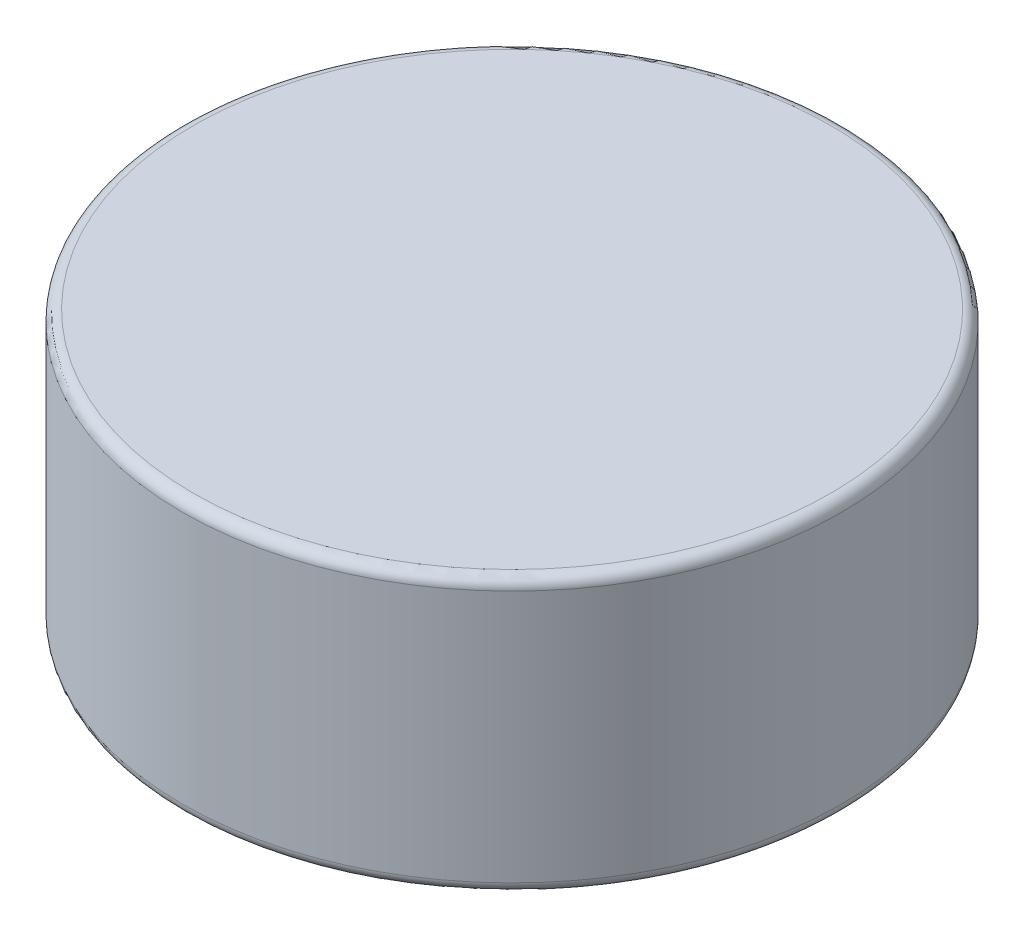
ISO-10303-21;
HEADER;
FILE_DESCRIPTION(('STEP AP214'),'2;1');
FILE_NAME('part.step','',(''),(''),'','','');
FILE_SCHEMA(('AUTOMOTIVE_DESIGN { 1 0 10303 214 1 1 1 1 }'));
ENDSEC;
DATA;
#1=APPLICATION_CONTEXT('core data for automotive mechanical design processes');
#2=APPLICATION_PROTOCOL_DEFINITION('international standard','automotive_design',2000,#1);
#3=PRODUCT_CONTEXT('',#1,'mechanical');
#4=PRODUCT('Part','Part','',(#3));
#5=PRODUCT_RELATED_PRODUCT_CATEGORY('part','',(#4));
#6=PRODUCT_DEFINITION_FORMATION('','',#4);
#7=PRODUCT_DEFINITION_CONTEXT('part definition',#1,'design');
#8=PRODUCT_DEFINITION('design','',#6,#7);
#9=PRODUCT_DEFINITION_SHAPE('','',#8);
#10=(LENGTH_UNIT() NAMED_UNIT(*) SI_UNIT(.MILLI.,.METRE.));
#11=(NAMED_UNIT(*) PLANE_ANGLE_UNIT() SI_UNIT($,.RADIAN.));
#12=(NAMED_UNIT(*) SI_UNIT($,.STERADIAN.) SOLID_ANGLE_UNIT());
#13=UNCERTAINTY_MEASURE_WITH_UNIT(LENGTH_MEASURE(1.E-05),#10,'distance_accuracy_value','');
#14=(GEOMETRIC_REPRESENTATION_CONTEXT(3) GLOBAL_UNCERTAINTY_ASSIGNED_CONTEXT((#13)) GLOBAL_UNIT_ASSIGNED_CONTEXT((#10,
#11,#12)) REPRESENTATION_CONTEXT('',''));
#15=CARTESIAN_POINT('',(0.,0.,0.));
#16=DIRECTION('',(0.,0.,1.));
#17=DIRECTION('',(1.,0.,0.));
#18=AXIS2_PLACEMENT_3D('',#15,#16,#17);
#19=CARTESIAN_POINT('',(0.,1.25,0.));
#20=DIRECTION('',(0.,-1.,0.));
#21=DIRECTION('',(0.,0.,-1.));
#22=AXIS2_PLACEMENT_3D('',#19,#20,#21);
#23=CYLINDRICAL_SURFACE('',#22,3.);
#24=CARTESIAN_POINT('',(0.,-1.15,0.));
#25=DIRECTION('',(0.,1.,0.));
#26=DIRECTION('',(0.,0.,1.));
#27=AXIS2_PLACEMENT_3D('',#24,#25,#26);
#28=CIRCLE('',#27,3.);
#29=CARTESIAN_POINT('',(0.,-1.15,3.));
#30=VERTEX_POINT('',#29);
#31=EDGE_CURVE('E46',#30,#30,#28,.T.);
#32=ORIENTED_EDGE('',*,*,#31,.T.);
#33=EDGE_LOOP('',(#32));
#34=FACE_BOUND('',#33,.T.);
#35=CARTESIAN_POINT('',(0.,1.15,0.));
#36=DIRECTION('',(0.,1.,0.));
#37=DIRECTION('',(0.,0.,1.));
#38=AXIS2_PLACEMENT_3D('',#35,#36,#37);
#39=CIRCLE('',#38,3.);
#40=CARTESIAN_POINT('',(0.,1.15,3.));
#41=VERTEX_POINT('',#40);
#42=EDGE_CURVE('E50',#41,#41,#39,.F.);
#43=ORIENTED_EDGE('',*,*,#42,.T.);
#44=EDGE_LOOP('',(#43));
#45=FACE_BOUND('',#44,.T.);
#46=ADVANCED_FACE('F35',(#34,#45),#23,.T.);
#47=CARTESIAN_POINT('',(0.,1.25,0.));
#48=DIRECTION('',(0.,1.,0.));
#49=DIRECTION('',(0.,0.,1.));
#50=AXIS2_PLACEMENT_3D('',#47,#48,#49);
#51=PLANE('',#50);
#52=CARTESIAN_POINT('',(0.,1.25,0.));
#53=DIRECTION('',(0.,1.,0.));
#54=DIRECTION('',(0.,0.,1.));
#55=AXIS2_PLACEMENT_3D('',#52,#53,#54);
#56=CIRCLE('',#55,2.9);
#57=CARTESIAN_POINT('',(0.,1.25,2.9));
#58=VERTEX_POINT('',#57);
#59=EDGE_CURVE('E10',#58,#58,#56,.T.);
#60=ORIENTED_EDGE('',*,*,#59,.T.);
#61=EDGE_LOOP('',(#60));
#62=FACE_BOUND('',#61,.T.);
#63=ADVANCED_FACE('F66',(#62),#51,.T.);
#64=CARTESIAN_POINT('',(0.,-1.25,0.));
#65=DIRECTION('',(0.,1.,0.));
#66=DIRECTION('',(0.,0.,1.));
#67=AXIS2_PLACEMENT_3D('',#64,#65,#66);
#68=PLANE('',#67);
#69=CARTESIAN_POINT('',(0.,-1.25,0.));
#70=DIRECTION('',(0.,1.,0.));
#71=DIRECTION('',(0.,0.,1.));
#72=AXIS2_PLACEMENT_3D('',#69,#70,#71);
#73=CIRCLE('',#72,2.9);
#74=CARTESIAN_POINT('',(0.,-1.25,2.9));
#75=VERTEX_POINT('',#74);
#76=EDGE_CURVE('E42',#75,#75,#73,.F.);
#77=ORIENTED_EDGE('',*,*,#76,.T.);
#78=EDGE_LOOP('',(#77));
#79=FACE_BOUND('',#78,.T.);
#80=ADVANCED_FACE('F63',(#79),#68,.F.);
#81=CARTESIAN_POINT('',(0.,-1.15,0.));
#82=DIRECTION('',(0.,1.,0.));
#83=DIRECTION('',(0.,0.,1.));
#84=AXIS2_PLACEMENT_3D('',#81,#82,#83);
#85=TOROIDAL_SURFACE('',#84,2.9,0.1);
#86=ORIENTED_EDGE('',*,*,#76,.F.);
#87=EDGE_LOOP('',(#86));
#88=FACE_BOUND('',#87,.T.);
#89=ORIENTED_EDGE('',*,*,#31,.F.);
#90=EDGE_LOOP('',(#89));
#91=FACE_BOUND('',#90,.T.);
#92=ADVANCED_FACE('F59',(#88,#91),#85,.T.);
#93=CARTESIAN_POINT('',(0.,1.15,0.));
#94=DIRECTION('',(0.,1.,0.));
#95=DIRECTION('',(0.,0.,1.));
#96=AXIS2_PLACEMENT_3D('',#93,#94,#95);
#97=TOROIDAL_SURFACE('',#96,2.9,0.1);
#98=ORIENTED_EDGE('',*,*,#42,.F.);
#99=EDGE_LOOP('',(#98));
#100=FACE_BOUND('',#99,.T.);
#101=ORIENTED_EDGE('',*,*,#59,.F.);
#102=EDGE_LOOP('',(#101));
#103=FACE_BOUND('',#102,.T.);
#104=ADVANCED_FACE('F37',(#100,#103),#97,.T.);
#105=CLOSED_SHELL('',(#46,#63,#80,#92,#104));
#106=MANIFOLD_SOLID_BREP('B2',#105);
#107=ADVANCED_BREP_SHAPE_REPRESENTATION('',(#18,#106),#14);
#108=SHAPE_DEFINITION_REPRESENTATION(#9,#107);
ENDSEC;
END-ISO-10303-21;
